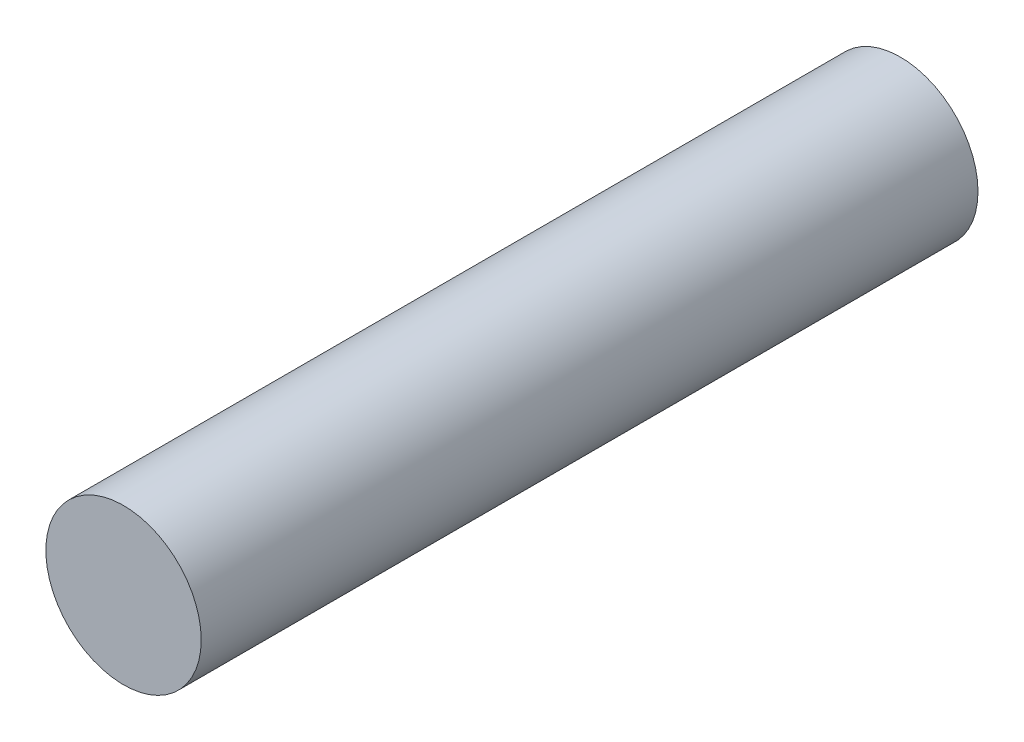
ISO-10303-21;
HEADER;
FILE_DESCRIPTION(('STEP AP214'),'2;1');
FILE_NAME('part.step','',(''),(''),'','','');
FILE_SCHEMA(('AUTOMOTIVE_DESIGN { 1 0 10303 214 1 1 1 1 }'));
ENDSEC;
DATA;
#1=APPLICATION_CONTEXT('core data for automotive mechanical design processes');
#2=APPLICATION_PROTOCOL_DEFINITION('international standard','automotive_design',2000,#1);
#3=PRODUCT_CONTEXT('',#1,'mechanical');
#4=PRODUCT('Part','Part','',(#3));
#5=PRODUCT_RELATED_PRODUCT_CATEGORY('part','',(#4));
#6=PRODUCT_DEFINITION_FORMATION('','',#4);
#7=PRODUCT_DEFINITION_CONTEXT('part definition',#1,'design');
#8=PRODUCT_DEFINITION('design','',#6,#7);
#9=PRODUCT_DEFINITION_SHAPE('','',#8);
#10=(LENGTH_UNIT() NAMED_UNIT(*) SI_UNIT(.MILLI.,.METRE.));
#11=(NAMED_UNIT(*) PLANE_ANGLE_UNIT() SI_UNIT($,.RADIAN.));
#12=(NAMED_UNIT(*) SI_UNIT($,.STERADIAN.) SOLID_ANGLE_UNIT());
#13=UNCERTAINTY_MEASURE_WITH_UNIT(LENGTH_MEASURE(1.E-05),#10,'distance_accuracy_value','');
#14=(GEOMETRIC_REPRESENTATION_CONTEXT(3) GLOBAL_UNCERTAINTY_ASSIGNED_CONTEXT((#13)) GLOBAL_UNIT_ASSIGNED_CONTEXT((#10,
#11,#12)) REPRESENTATION_CONTEXT('',''));
#15=CARTESIAN_POINT('',(0.,0.,0.));
#16=DIRECTION('',(0.,0.,1.));
#17=DIRECTION('',(1.,0.,0.));
#18=AXIS2_PLACEMENT_3D('',#15,#16,#17);
#19=CARTESIAN_POINT('',(0.,0.,-38.1));
#20=DIRECTION('',(0.,0.,1.));
#21=DIRECTION('',(1.,0.,0.));
#22=AXIS2_PLACEMENT_3D('',#19,#20,#21);
#23=CYLINDRICAL_SURFACE('',#22,3.81);
#24=CARTESIAN_POINT('',(0.,0.,-38.1));
#25=DIRECTION('',(0.,0.,1.));
#26=DIRECTION('',(1.,0.,0.));
#27=AXIS2_PLACEMENT_3D('',#24,#25,#26);
#28=CIRCLE('',#27,3.81);
#29=CARTESIAN_POINT('',(3.81,0.,-38.1));
#30=VERTEX_POINT('',#29);
#31=EDGE_CURVE('E12',#30,#30,#28,.T.);
#32=CARTESIAN_POINT('',(0.,0.,0.));
#33=DIRECTION('',(0.,0.,1.));
#34=DIRECTION('',(1.,0.,0.));
#35=AXIS2_PLACEMENT_3D('',#32,#33,#34);
#36=CIRCLE('',#35,3.81);
#37=CARTESIAN_POINT('',(3.81,0.,0.));
#38=VERTEX_POINT('',#37);
#39=EDGE_CURVE('E47',#38,#38,#36,.T.);
#40=CARTESIAN_POINT('',(3.81,0.,-38.1));
#41=CARTESIAN_POINT('',(3.81,0.,-37.703125));
#42=CARTESIAN_POINT('',(3.81,0.,-37.30625));
#43=CARTESIAN_POINT('',(3.81,0.,-36.5125));
#44=CARTESIAN_POINT('',(3.81,0.,-36.115625));
#45=CARTESIAN_POINT('',(3.81,0.,-35.321875));
#46=CARTESIAN_POINT('',(3.81,0.,-34.925));
#47=CARTESIAN_POINT('',(3.81,0.,-34.13125));
#48=CARTESIAN_POINT('',(3.81,0.,-33.734375));
#49=CARTESIAN_POINT('',(3.81,0.,-32.940625));
#50=CARTESIAN_POINT('',(3.81,0.,-32.54375));
#51=CARTESIAN_POINT('',(3.81,0.,-31.75));
#52=CARTESIAN_POINT('',(3.81,0.,-31.353125));
#53=CARTESIAN_POINT('',(3.81,0.,-30.559375));
#54=CARTESIAN_POINT('',(3.81,0.,-30.1625));
#55=CARTESIAN_POINT('',(3.81,0.,-29.36875));
#56=CARTESIAN_POINT('',(3.81,0.,-28.971875));
#57=CARTESIAN_POINT('',(3.81,0.,-28.178125));
#58=CARTESIAN_POINT('',(3.81,0.,-27.78125));
#59=CARTESIAN_POINT('',(3.81,0.,-26.9875));
#60=CARTESIAN_POINT('',(3.81,0.,-26.590625));
#61=CARTESIAN_POINT('',(3.81,0.,-25.796875));
#62=CARTESIAN_POINT('',(3.81,0.,-25.4));
#63=CARTESIAN_POINT('',(3.81,0.,-24.60625));
#64=CARTESIAN_POINT('',(3.81,0.,-24.209375));
#65=CARTESIAN_POINT('',(3.81,0.,-23.415625));
#66=CARTESIAN_POINT('',(3.81,0.,-23.01875));
#67=CARTESIAN_POINT('',(3.81,0.,-22.225));
#68=CARTESIAN_POINT('',(3.81,0.,-21.828125));
#69=CARTESIAN_POINT('',(3.81,0.,-21.034375));
#70=CARTESIAN_POINT('',(3.81,0.,-20.6375));
#71=CARTESIAN_POINT('',(3.81,0.,-19.84375));
#72=CARTESIAN_POINT('',(3.81,0.,-19.446875));
#73=CARTESIAN_POINT('',(3.81,0.,-18.653125));
#74=CARTESIAN_POINT('',(3.81,0.,-18.25625));
#75=CARTESIAN_POINT('',(3.81,0.,-17.4625));
#76=CARTESIAN_POINT('',(3.81,0.,-17.065625));
#77=CARTESIAN_POINT('',(3.81,0.,-16.271875));
#78=CARTESIAN_POINT('',(3.81,0.,-15.875));
#79=CARTESIAN_POINT('',(3.81,0.,-15.08125));
#80=CARTESIAN_POINT('',(3.81,0.,-14.684375));
#81=CARTESIAN_POINT('',(3.81,0.,-13.890625));
#82=CARTESIAN_POINT('',(3.81,0.,-13.49375));
#83=CARTESIAN_POINT('',(3.81,0.,-12.7));
#84=CARTESIAN_POINT('',(3.81,0.,-12.303125));
#85=CARTESIAN_POINT('',(3.81,0.,-11.509375));
#86=CARTESIAN_POINT('',(3.81,0.,-11.1125));
#87=CARTESIAN_POINT('',(3.81,0.,-10.31875));
#88=CARTESIAN_POINT('',(3.81,0.,-9.921875));
#89=CARTESIAN_POINT('',(3.81,0.,-9.128125));
#90=CARTESIAN_POINT('',(3.81,0.,-8.73125));
#91=CARTESIAN_POINT('',(3.81,0.,-7.9375));
#92=CARTESIAN_POINT('',(3.81,0.,-7.540625));
#93=CARTESIAN_POINT('',(3.81,0.,-6.746875));
#94=CARTESIAN_POINT('',(3.81,0.,-6.35));
#95=CARTESIAN_POINT('',(3.81,0.,-5.55625));
#96=CARTESIAN_POINT('',(3.81,0.,-5.159375));
#97=CARTESIAN_POINT('',(3.81,0.,-4.365625));
#98=CARTESIAN_POINT('',(3.81,0.,-3.96875));
#99=CARTESIAN_POINT('',(3.81,0.,-3.175));
#100=CARTESIAN_POINT('',(3.81,0.,-2.778125));
#101=CARTESIAN_POINT('',(3.81,0.,-1.984375));
#102=CARTESIAN_POINT('',(3.81,0.,-1.5875));
#103=CARTESIAN_POINT('',(3.81,0.,-0.79375));
#104=CARTESIAN_POINT('',(3.81,0.,-0.396875));
#105=CARTESIAN_POINT('',(3.81,0.,0.));
#106=B_SPLINE_CURVE_WITH_KNOTS('',3,(#40,#41,#42,#43,#44,#45,#46,#47,#48,#49,#50,#51,#52,#53,
#54,#55,#56,#57,#58,#59,#60,#61,#62,#63,#64,#65,#66,#67,#68,#69,#70,#71,#72,#73,#74,#75,#76,#77,
#78,#79,#80,#81,#82,#83,#84,#85,#86,#87,#88,#89,#90,#91,#92,#93,#94,#95,#96,#97,#98,#99,#100,
#101,#102,#103,#104,#105),.UNSPECIFIED.,.F.,.F.,(4,2,2,2,2,2,2,2,2,2,2,2,2,2,2,2,2,2,2,2,2,2,2,
2,2,2,2,2,2,2,2,2,4),(0.,1.190625,2.38125,3.571875,4.7625,5.953125,7.14375,8.334375,
9.52500000000001,10.715625,11.90625,13.096875,14.2875,15.478125,16.66875,17.859375,19.05,
20.240625,21.43125,22.621875,23.8125,25.003125,26.19375,27.384375,28.575,29.765625,30.95625,
32.146875,33.3375,34.528125,35.71875,36.909375,38.1),.UNSPECIFIED.);
#107=EDGE_CURVE('BSEAM44',#30,#38,#106,.T.);
#108=ORIENTED_EDGE('',*,*,#31,.T.);
#109=ORIENTED_EDGE('',*,*,#39,.F.);
#110=ORIENTED_EDGE('',*,*,#107,.T.);
#111=ORIENTED_EDGE('',*,*,#107,.F.);
#112=EDGE_LOOP('',(#108,#110,#109,#111));
#113=FACE_BOUND('',#112,.T.);
#114=ADVANCED_FACE('F44',(#113),#23,.T.);
#115=CARTESIAN_POINT('',(0.,0.,-38.1));
#116=DIRECTION('',(0.,0.,1.));
#117=DIRECTION('',(1.,0.,0.));
#118=AXIS2_PLACEMENT_3D('',#115,#116,#117);
#119=PLANE('',#118);
#120=ORIENTED_EDGE('',*,*,#31,.F.);
#121=EDGE_LOOP('',(#120));
#122=FACE_BOUND('',#121,.T.);
#123=ADVANCED_FACE('F59',(#122),#119,.F.);
#124=CARTESIAN_POINT('',(0.,0.,0.));
#125=DIRECTION('',(0.,0.,1.));
#126=DIRECTION('',(1.,0.,0.));
#127=AXIS2_PLACEMENT_3D('',#124,#125,#126);
#128=PLANE('',#127);
#129=ORIENTED_EDGE('',*,*,#39,.T.);
#130=EDGE_LOOP('',(#129));
#131=FACE_BOUND('',#130,.T.);
#132=ADVANCED_FACE('F56',(#131),#128,.T.);
#133=CLOSED_SHELL('',(#114,#123,#132));
#134=MANIFOLD_SOLID_BREP('B2',#133);
#135=ADVANCED_BREP_SHAPE_REPRESENTATION('',(#18,#134),#14);
#136=SHAPE_DEFINITION_REPRESENTATION(#9,#135);
ENDSEC;
END-ISO-10303-21;
